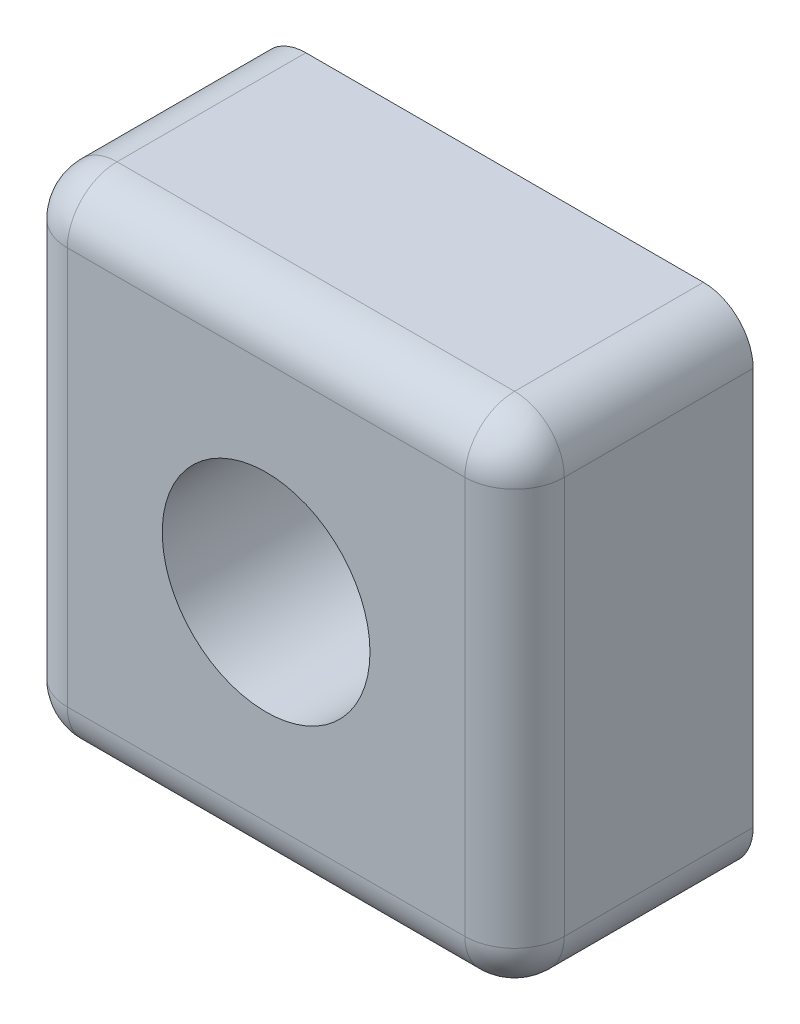
ISO-10303-21;
HEADER;
FILE_DESCRIPTION(('STEP AP214'),'2;1');
FILE_NAME('part.step','',(''),(''),'','','');
FILE_SCHEMA(('AUTOMOTIVE_DESIGN { 1 0 10303 214 1 1 1 1 }'));
ENDSEC;
DATA;
#1=APPLICATION_CONTEXT('core data for automotive mechanical design processes');
#2=APPLICATION_PROTOCOL_DEFINITION('international standard','automotive_design',2000,#1);
#3=PRODUCT_CONTEXT('',#1,'mechanical');
#4=PRODUCT('Part','Part','',(#3));
#5=PRODUCT_RELATED_PRODUCT_CATEGORY('part','',(#4));
#6=PRODUCT_DEFINITION_FORMATION('','',#4);
#7=PRODUCT_DEFINITION_CONTEXT('part definition',#1,'design');
#8=PRODUCT_DEFINITION('design','',#6,#7);
#9=PRODUCT_DEFINITION_SHAPE('','',#8);
#10=(LENGTH_UNIT() NAMED_UNIT(*) SI_UNIT(.MILLI.,.METRE.));
#11=(NAMED_UNIT(*) PLANE_ANGLE_UNIT() SI_UNIT($,.RADIAN.));
#12=(NAMED_UNIT(*) SI_UNIT($,.STERADIAN.) SOLID_ANGLE_UNIT());
#13=UNCERTAINTY_MEASURE_WITH_UNIT(LENGTH_MEASURE(1.E-05),#10,'distance_accuracy_value','');
#14=(GEOMETRIC_REPRESENTATION_CONTEXT(3) GLOBAL_UNCERTAINTY_ASSIGNED_CONTEXT((#13)) GLOBAL_UNIT_ASSIGNED_CONTEXT((#10,
#11,#12)) REPRESENTATION_CONTEXT('',''));
#15=CARTESIAN_POINT('',(0.,0.,0.));
#16=DIRECTION('',(0.,0.,1.));
#17=DIRECTION('',(1.,0.,0.));
#18=AXIS2_PLACEMENT_3D('',#15,#16,#17);
#19=CARTESIAN_POINT('',(0.,-50.,48.));
#20=DIRECTION('',(0.,-1.,0.));
#21=DIRECTION('',(0.,0.,-1.));
#22=AXIS2_PLACEMENT_3D('',#19,#20,#21);
#23=PLANE('',#22);
#24=DIRECTION('',(0.,0.,-1.));
#25=VECTOR('',#24,1.);
#26=CARTESIAN_POINT('',(40.,-50.,48.));
#27=LINE('',#26,#25);
#28=CARTESIAN_POINT('',(40.,-50.,0.));
#29=VERTEX_POINT('',#28);
#30=CARTESIAN_POINT('',(40.,-50.,38.));
#31=VERTEX_POINT('',#30);
#32=EDGE_CURVE('E159',#29,#31,#27,.F.);
#33=ORIENTED_EDGE('',*,*,#32,.T.);
#34=DIRECTION('',(-1.,0.,0.));
#35=VECTOR('',#34,1.);
#36=CARTESIAN_POINT('',(0.,-50.,38.));
#37=LINE('',#36,#35);
#38=CARTESIAN_POINT('',(-40.,-50.,38.));
#39=VERTEX_POINT('',#38);
#40=EDGE_CURVE('E170',#31,#39,#37,.T.);
#41=ORIENTED_EDGE('',*,*,#40,.T.);
#42=DIRECTION('',(0.,0.,-1.));
#43=VECTOR('',#42,1.);
#44=CARTESIAN_POINT('',(-40.,-50.,48.));
#45=LINE('',#44,#43);
#46=CARTESIAN_POINT('',(-40.,-50.,0.));
#47=VERTEX_POINT('',#46);
#48=EDGE_CURVE('E157',#39,#47,#45,.T.);
#49=ORIENTED_EDGE('',*,*,#48,.T.);
#50=DIRECTION('',(-1.,0.,0.));
#51=VECTOR('',#50,1.);
#52=CARTESIAN_POINT('',(0.,-50.,0.));
#53=LINE('',#52,#51);
#54=EDGE_CURVE('E143',#29,#47,#53,.T.);
#55=ORIENTED_EDGE('',*,*,#54,.F.);
#56=EDGE_LOOP('',(#33,#41,#49,#55));
#57=FACE_BOUND('',#56,.T.);
#58=ADVANCED_FACE('F38',(#57),#23,.T.);
#59=CARTESIAN_POINT('',(50.,0.,48.));
#60=DIRECTION('',(-1.,0.,0.));
#61=DIRECTION('',(0.,-1.,0.));
#62=AXIS2_PLACEMENT_3D('',#59,#60,#61);
#63=PLANE('',#62);
#64=DIRECTION('',(0.,0.,-1.));
#65=VECTOR('',#64,1.);
#66=CARTESIAN_POINT('',(50.,40.,48.));
#67=LINE('',#66,#65);
#68=CARTESIAN_POINT('',(50.,40.,0.));
#69=VERTEX_POINT('',#68);
#70=CARTESIAN_POINT('',(50.,40.,38.));
#71=VERTEX_POINT('',#70);
#72=EDGE_CURVE('E127',#69,#71,#67,.F.);
#73=ORIENTED_EDGE('',*,*,#72,.T.);
#74=DIRECTION('',(0.,1.,0.));
#75=VECTOR('',#74,1.);
#76=CARTESIAN_POINT('',(50.,-40.,38.));
#77=LINE('',#76,#75);
#78=CARTESIAN_POINT('',(50.,-40.,38.));
#79=VERTEX_POINT('',#78);
#80=EDGE_CURVE('E11',#71,#79,#77,.F.);
#81=ORIENTED_EDGE('',*,*,#80,.T.);
#82=DIRECTION('',(0.,0.,-1.));
#83=VECTOR('',#82,1.);
#84=CARTESIAN_POINT('',(50.,-40.,0.));
#85=LINE('',#84,#83);
#86=CARTESIAN_POINT('',(50.,-40.,0.));
#87=VERTEX_POINT('',#86);
#88=EDGE_CURVE('E131',#79,#87,#85,.T.);
#89=ORIENTED_EDGE('',*,*,#88,.T.);
#90=DIRECTION('',(0.,1.,0.));
#91=VECTOR('',#90,1.);
#92=CARTESIAN_POINT('',(50.,0.,0.));
#93=LINE('',#92,#91);
#94=EDGE_CURVE('E139',#87,#69,#93,.T.);
#95=ORIENTED_EDGE('',*,*,#94,.T.);
#96=EDGE_LOOP('',(#73,#81,#89,#95));
#97=FACE_BOUND('',#96,.T.);
#98=ADVANCED_FACE('F235',(#97),#63,.F.);
#99=CARTESIAN_POINT('',(0.,50.,48.));
#100=DIRECTION('',(0.,-1.,0.));
#101=DIRECTION('',(0.,0.,-1.));
#102=AXIS2_PLACEMENT_3D('',#99,#100,#101);
#103=PLANE('',#102);
#104=DIRECTION('',(0.,0.,-1.));
#105=VECTOR('',#104,1.);
#106=CARTESIAN_POINT('',(-40.,50.,48.));
#107=LINE('',#106,#105);
#108=CARTESIAN_POINT('',(-40.,50.,0.));
#109=VERTEX_POINT('',#108);
#110=CARTESIAN_POINT('',(-40.,50.,38.));
#111=VERTEX_POINT('',#110);
#112=EDGE_CURVE('E123',#109,#111,#107,.F.);
#113=ORIENTED_EDGE('',*,*,#112,.T.);
#114=DIRECTION('',(-1.,0.,0.));
#115=VECTOR('',#114,1.);
#116=CARTESIAN_POINT('',(40.,50.,38.));
#117=LINE('',#116,#115);
#118=CARTESIAN_POINT('',(40.,50.,38.));
#119=VERTEX_POINT('',#118);
#120=EDGE_CURVE('E62',#111,#119,#117,.F.);
#121=ORIENTED_EDGE('',*,*,#120,.T.);
#122=DIRECTION('',(0.,0.,-1.));
#123=VECTOR('',#122,1.);
#124=CARTESIAN_POINT('',(40.,50.,48.));
#125=LINE('',#124,#123);
#126=CARTESIAN_POINT('',(40.,50.,0.));
#127=VERTEX_POINT('',#126);
#128=EDGE_CURVE('E115',#119,#127,#125,.T.);
#129=ORIENTED_EDGE('',*,*,#128,.T.);
#130=DIRECTION('',(-1.,0.,0.));
#131=VECTOR('',#130,1.);
#132=CARTESIAN_POINT('',(0.,50.,0.));
#133=LINE('',#132,#131);
#134=EDGE_CURVE('E119',#127,#109,#133,.T.);
#135=ORIENTED_EDGE('',*,*,#134,.T.);
#136=EDGE_LOOP('',(#113,#121,#129,#135));
#137=FACE_BOUND('',#136,.T.);
#138=ADVANCED_FACE('F117',(#137),#103,.F.);
#139=CARTESIAN_POINT('',(-50.,0.,48.));
#140=DIRECTION('',(-1.,0.,0.));
#141=DIRECTION('',(0.,-1.,0.));
#142=AXIS2_PLACEMENT_3D('',#139,#140,#141);
#143=PLANE('',#142);
#144=DIRECTION('',(0.,0.,-1.));
#145=VECTOR('',#144,1.);
#146=CARTESIAN_POINT('',(-50.,-40.,48.));
#147=LINE('',#146,#145);
#148=CARTESIAN_POINT('',(-50.,-40.,0.));
#149=VERTEX_POINT('',#148);
#150=CARTESIAN_POINT('',(-50.,-40.,38.));
#151=VERTEX_POINT('',#150);
#152=EDGE_CURVE('E164',#149,#151,#147,.F.);
#153=ORIENTED_EDGE('',*,*,#152,.T.);
#154=DIRECTION('',(0.,1.,0.));
#155=VECTOR('',#154,1.);
#156=CARTESIAN_POINT('',(-50.,0.,38.));
#157=LINE('',#156,#155);
#158=CARTESIAN_POINT('',(-50.,40.,38.));
#159=VERTEX_POINT('',#158);
#160=EDGE_CURVE('E183',#151,#159,#157,.T.);
#161=ORIENTED_EDGE('',*,*,#160,.T.);
#162=DIRECTION('',(0.,0.,-1.));
#163=VECTOR('',#162,1.);
#164=CARTESIAN_POINT('',(-50.,40.,0.));
#165=LINE('',#164,#163);
#166=CARTESIAN_POINT('',(-50.,40.,0.));
#167=VERTEX_POINT('',#166);
#168=EDGE_CURVE('E162',#159,#167,#165,.T.);
#169=ORIENTED_EDGE('',*,*,#168,.T.);
#170=DIRECTION('',(0.,1.,0.));
#171=VECTOR('',#170,1.);
#172=CARTESIAN_POINT('',(-50.,0.,0.));
#173=LINE('',#172,#171);
#174=EDGE_CURVE('E138',#149,#167,#173,.T.);
#175=ORIENTED_EDGE('',*,*,#174,.F.);
#176=EDGE_LOOP('',(#153,#161,#169,#175));
#177=FACE_BOUND('',#176,.T.);
#178=ADVANCED_FACE('F232',(#177),#143,.T.);
#179=CARTESIAN_POINT('',(0.,0.,48.));
#180=DIRECTION('',(0.,0.,-1.));
#181=DIRECTION('',(-1.,0.,0.));
#182=AXIS2_PLACEMENT_3D('',#179,#180,#181);
#183=CYLINDRICAL_SURFACE('',#182,20.9);
#184=CARTESIAN_POINT('',(0.,0.,48.));
#185=DIRECTION('',(0.,0.,1.));
#186=DIRECTION('',(1.,0.,0.));
#187=AXIS2_PLACEMENT_3D('',#184,#185,#186);
#188=CIRCLE('',#187,20.9);
#189=CARTESIAN_POINT('',(20.9,0.,48.));
#190=VERTEX_POINT('',#189);
#191=EDGE_CURVE('E149',#190,#190,#188,.T.);
#192=ORIENTED_EDGE('',*,*,#191,.T.);
#193=EDGE_LOOP('',(#192));
#194=FACE_BOUND('',#193,.T.);
#195=CARTESIAN_POINT('',(0.,0.,0.));
#196=DIRECTION('',(0.,0.,1.));
#197=DIRECTION('',(1.,0.,0.));
#198=AXIS2_PLACEMENT_3D('',#195,#196,#197);
#199=CIRCLE('',#198,20.9);
#200=CARTESIAN_POINT('',(20.9,0.,0.));
#201=VERTEX_POINT('',#200);
#202=EDGE_CURVE('E141',#201,#201,#199,.T.);
#203=ORIENTED_EDGE('',*,*,#202,.F.);
#204=EDGE_LOOP('',(#203));
#205=FACE_BOUND('',#204,.T.);
#206=ADVANCED_FACE('F220',(#194,#205),#183,.F.);
#207=CARTESIAN_POINT('',(0.,0.,48.));
#208=DIRECTION('',(0.,0.,1.));
#209=DIRECTION('',(1.,0.,0.));
#210=AXIS2_PLACEMENT_3D('',#207,#208,#209);
#211=PLANE('',#210);
#212=DIRECTION('',(0.,1.,0.));
#213=VECTOR('',#212,1.);
#214=CARTESIAN_POINT('',(-40.,0.,48.));
#215=LINE('',#214,#213);
#216=CARTESIAN_POINT('',(-40.,40.,48.));
#217=VERTEX_POINT('',#216);
#218=CARTESIAN_POINT('',(-40.,-40.,48.));
#219=VERTEX_POINT('',#218);
#220=EDGE_CURVE('E176',#217,#219,#215,.F.);
#221=ORIENTED_EDGE('',*,*,#220,.T.);
#222=DIRECTION('',(-1.,0.,0.));
#223=VECTOR('',#222,1.);
#224=CARTESIAN_POINT('',(0.,-40.,48.));
#225=LINE('',#224,#223);
#226=CARTESIAN_POINT('',(40.,-40.,48.));
#227=VERTEX_POINT('',#226);
#228=EDGE_CURVE('E178',#219,#227,#225,.F.);
#229=ORIENTED_EDGE('',*,*,#228,.T.);
#230=DIRECTION('',(0.,1.,0.));
#231=VECTOR('',#230,1.);
#232=CARTESIAN_POINT('',(40.,40.,48.));
#233=LINE('',#232,#231);
#234=CARTESIAN_POINT('',(40.,40.,48.));
#235=VERTEX_POINT('',#234);
#236=EDGE_CURVE('E172',#227,#235,#233,.T.);
#237=ORIENTED_EDGE('',*,*,#236,.T.);
#238=DIRECTION('',(-1.,0.,0.));
#239=VECTOR('',#238,1.);
#240=CARTESIAN_POINT('',(-40.,40.,48.));
#241=LINE('',#240,#239);
#242=EDGE_CURVE('E174',#235,#217,#241,.T.);
#243=ORIENTED_EDGE('',*,*,#242,.T.);
#244=EDGE_LOOP('',(#221,#229,#237,#243));
#245=FACE_BOUND('',#244,.T.);
#246=ORIENTED_EDGE('',*,*,#191,.F.);
#247=EDGE_LOOP('',(#246));
#248=FACE_BOUND('',#247,.T.);
#249=ADVANCED_FACE('F223',(#245,#248),#211,.T.);
#250=CARTESIAN_POINT('',(0.,0.,0.));
#251=DIRECTION('',(0.,0.,1.));
#252=DIRECTION('',(1.,0.,0.));
#253=AXIS2_PLACEMENT_3D('',#250,#251,#252);
#254=PLANE('',#253);
#255=ORIENTED_EDGE('',*,*,#134,.F.);
#256=CARTESIAN_POINT('',(40.,40.,0.));
#257=DIRECTION('',(0.,0.,1.));
#258=DIRECTION('',(1.,0.,0.));
#259=AXIS2_PLACEMENT_3D('',#256,#257,#258);
#260=CIRCLE('',#259,10.);
#261=EDGE_CURVE('E125',#127,#69,#260,.F.);
#262=ORIENTED_EDGE('',*,*,#261,.T.);
#263=ORIENTED_EDGE('',*,*,#94,.F.);
#264=CARTESIAN_POINT('',(40.,-40.,0.));
#265=DIRECTION('',(0.,0.,1.));
#266=DIRECTION('',(1.,0.,0.));
#267=AXIS2_PLACEMENT_3D('',#264,#265,#266);
#268=CIRCLE('',#267,10.);
#269=EDGE_CURVE('E132',#87,#29,#268,.F.);
#270=ORIENTED_EDGE('',*,*,#269,.T.);
#271=ORIENTED_EDGE('',*,*,#54,.T.);
#272=CARTESIAN_POINT('',(-40.,-40.,0.));
#273=DIRECTION('',(0.,0.,1.));
#274=DIRECTION('',(1.,0.,0.));
#275=AXIS2_PLACEMENT_3D('',#272,#273,#274);
#276=CIRCLE('',#275,10.);
#277=EDGE_CURVE('E152',#47,#149,#276,.F.);
#278=ORIENTED_EDGE('',*,*,#277,.T.);
#279=ORIENTED_EDGE('',*,*,#174,.T.);
#280=CARTESIAN_POINT('',(-40.,40.,0.));
#281=DIRECTION('',(0.,0.,1.));
#282=DIRECTION('',(1.,0.,0.));
#283=AXIS2_PLACEMENT_3D('',#280,#281,#282);
#284=CIRCLE('',#283,10.);
#285=EDGE_CURVE('E122',#167,#109,#284,.F.);
#286=ORIENTED_EDGE('',*,*,#285,.T.);
#287=EDGE_LOOP('',(#255,#262,#263,#270,#271,#278,#279,#286));
#288=FACE_BOUND('',#287,.T.);
#289=ORIENTED_EDGE('',*,*,#202,.T.);
#290=EDGE_LOOP('',(#289));
#291=FACE_BOUND('',#290,.T.);
#292=ADVANCED_FACE('F134',(#288,#291),#254,.F.);
#293=CARTESIAN_POINT('',(40.,40.,48.));
#294=DIRECTION('',(0.,0.,-1.));
#295=DIRECTION('',(-1.,0.,0.));
#296=AXIS2_PLACEMENT_3D('',#293,#294,#295);
#297=CYLINDRICAL_SURFACE('',#296,10.);
#298=ORIENTED_EDGE('',*,*,#128,.F.);
#299=CARTESIAN_POINT('',(40.,40.,38.));
#300=DIRECTION('',(0.,0.,-1.));
#301=DIRECTION('',(-1.,0.,0.));
#302=AXIS2_PLACEMENT_3D('',#299,#300,#301);
#303=CIRCLE('',#302,10.);
#304=EDGE_CURVE('E47',#119,#71,#303,.T.);
#305=ORIENTED_EDGE('',*,*,#304,.T.);
#306=ORIENTED_EDGE('',*,*,#72,.F.);
#307=ORIENTED_EDGE('',*,*,#261,.F.);
#308=EDGE_LOOP('',(#298,#305,#306,#307));
#309=FACE_BOUND('',#308,.T.);
#310=ADVANCED_FACE('F126',(#309),#297,.T.);
#311=CARTESIAN_POINT('',(40.,-40.,48.));
#312=DIRECTION('',(0.,0.,1.));
#313=DIRECTION('',(1.,0.,0.));
#314=AXIS2_PLACEMENT_3D('',#311,#312,#313);
#315=CYLINDRICAL_SURFACE('',#314,10.);
#316=ORIENTED_EDGE('',*,*,#88,.F.);
#317=CARTESIAN_POINT('',(40.,-40.,38.));
#318=DIRECTION('',(0.,0.,1.));
#319=DIRECTION('',(1.,0.,0.));
#320=AXIS2_PLACEMENT_3D('',#317,#318,#319);
#321=CIRCLE('',#320,10.);
#322=EDGE_CURVE('E167',#79,#31,#321,.F.);
#323=ORIENTED_EDGE('',*,*,#322,.T.);
#324=ORIENTED_EDGE('',*,*,#32,.F.);
#325=ORIENTED_EDGE('',*,*,#269,.F.);
#326=EDGE_LOOP('',(#316,#323,#324,#325));
#327=FACE_BOUND('',#326,.T.);
#328=ADVANCED_FACE('F247',(#327),#315,.T.);
#329=CARTESIAN_POINT('',(-40.,-40.,48.));
#330=DIRECTION('',(0.,0.,-1.));
#331=DIRECTION('',(-1.,0.,0.));
#332=AXIS2_PLACEMENT_3D('',#329,#330,#331);
#333=CYLINDRICAL_SURFACE('',#332,10.);
#334=ORIENTED_EDGE('',*,*,#48,.F.);
#335=CARTESIAN_POINT('',(-40.,-40.,38.));
#336=DIRECTION('',(0.,0.,-1.));
#337=DIRECTION('',(-1.,0.,0.));
#338=AXIS2_PLACEMENT_3D('',#335,#336,#337);
#339=CIRCLE('',#338,10.);
#340=EDGE_CURVE('E181',#39,#151,#339,.T.);
#341=ORIENTED_EDGE('',*,*,#340,.T.);
#342=ORIENTED_EDGE('',*,*,#152,.F.);
#343=ORIENTED_EDGE('',*,*,#277,.F.);
#344=EDGE_LOOP('',(#334,#341,#342,#343));
#345=FACE_BOUND('',#344,.T.);
#346=ADVANCED_FACE('F250',(#345),#333,.T.);
#347=CARTESIAN_POINT('',(-40.,40.,48.));
#348=DIRECTION('',(0.,0.,1.));
#349=DIRECTION('',(1.,0.,0.));
#350=AXIS2_PLACEMENT_3D('',#347,#348,#349);
#351=CYLINDRICAL_SURFACE('',#350,10.);
#352=ORIENTED_EDGE('',*,*,#168,.F.);
#353=CARTESIAN_POINT('',(-40.,40.,38.));
#354=DIRECTION('',(0.,0.,1.));
#355=DIRECTION('',(1.,0.,0.));
#356=AXIS2_PLACEMENT_3D('',#353,#354,#355);
#357=CIRCLE('',#356,10.);
#358=EDGE_CURVE('E185',#159,#111,#357,.F.);
#359=ORIENTED_EDGE('',*,*,#358,.T.);
#360=ORIENTED_EDGE('',*,*,#112,.F.);
#361=ORIENTED_EDGE('',*,*,#285,.F.);
#362=EDGE_LOOP('',(#352,#359,#360,#361));
#363=FACE_BOUND('',#362,.T.);
#364=ADVANCED_FACE('F254',(#363),#351,.T.);
#365=CARTESIAN_POINT('',(-40.,40.,38.));
#366=DIRECTION('',(0.,0.,1.));
#367=DIRECTION('',(1.,0.,0.));
#368=AXIS2_PLACEMENT_3D('',#365,#366,#367);
#369=SPHERICAL_SURFACE('',#368,10.);
#370=CARTESIAN_POINT('',(-40.,40.,38.));
#371=DIRECTION('',(1.,0.,0.));
#372=DIRECTION('',(0.,0.,-1.));
#373=AXIS2_PLACEMENT_3D('',#370,#371,#372);
#374=CIRCLE('',#373,10.);
#375=EDGE_CURVE('E204',#111,#217,#374,.T.);
#376=ORIENTED_EDGE('',*,*,#375,.F.);
#377=ORIENTED_EDGE('',*,*,#358,.F.);
#378=CARTESIAN_POINT('',(-40.,40.,38.));
#379=DIRECTION('',(0.,-1.,0.));
#380=DIRECTION('',(0.,0.,-1.));
#381=AXIS2_PLACEMENT_3D('',#378,#379,#380);
#382=CIRCLE('',#381,10.);
#383=EDGE_CURVE('E42',#217,#159,#382,.T.);
#384=ORIENTED_EDGE('',*,*,#383,.F.);
#385=EDGE_LOOP('',(#376,#377,#384));
#386=FACE_BOUND('',#385,.T.);
#387=ADVANCED_FACE('F40',(#386),#369,.T.);
#388=CARTESIAN_POINT('',(-40.,0.,38.));
#389=DIRECTION('',(0.,1.,0.));
#390=DIRECTION('',(-1.,0.,0.));
#391=AXIS2_PLACEMENT_3D('',#388,#389,#390);
#392=CYLINDRICAL_SURFACE('',#391,10.);
#393=ORIENTED_EDGE('',*,*,#383,.T.);
#394=ORIENTED_EDGE('',*,*,#160,.F.);
#395=CARTESIAN_POINT('',(-40.,-40.,38.));
#396=DIRECTION('',(0.,-1.,0.));
#397=DIRECTION('',(0.,0.,-1.));
#398=AXIS2_PLACEMENT_3D('',#395,#396,#397);
#399=CIRCLE('',#398,10.);
#400=EDGE_CURVE('E202',#219,#151,#399,.T.);
#401=ORIENTED_EDGE('',*,*,#400,.F.);
#402=ORIENTED_EDGE('',*,*,#220,.F.);
#403=EDGE_LOOP('',(#393,#394,#401,#402));
#404=FACE_BOUND('',#403,.T.);
#405=ADVANCED_FACE('F281',(#404),#392,.T.);
#406=CARTESIAN_POINT('',(0.,40.,38.));
#407=DIRECTION('',(1.,0.,0.));
#408=DIRECTION('',(0.,0.,-1.));
#409=AXIS2_PLACEMENT_3D('',#406,#407,#408);
#410=CYLINDRICAL_SURFACE('',#409,10.);
#411=ORIENTED_EDGE('',*,*,#375,.T.);
#412=ORIENTED_EDGE('',*,*,#242,.F.);
#413=CARTESIAN_POINT('',(40.,40.,38.));
#414=DIRECTION('',(1.,0.,0.));
#415=DIRECTION('',(0.,0.,-1.));
#416=AXIS2_PLACEMENT_3D('',#413,#414,#415);
#417=CIRCLE('',#416,10.);
#418=EDGE_CURVE('E199',#119,#235,#417,.T.);
#419=ORIENTED_EDGE('',*,*,#418,.F.);
#420=ORIENTED_EDGE('',*,*,#120,.F.);
#421=EDGE_LOOP('',(#411,#412,#419,#420));
#422=FACE_BOUND('',#421,.T.);
#423=ADVANCED_FACE('F278',(#422),#410,.T.);
#424=CARTESIAN_POINT('',(-40.,-40.,38.));
#425=DIRECTION('',(0.,0.,1.));
#426=DIRECTION('',(1.,0.,0.));
#427=AXIS2_PLACEMENT_3D('',#424,#425,#426);
#428=SPHERICAL_SURFACE('',#427,10.);
#429=ORIENTED_EDGE('',*,*,#400,.T.);
#430=ORIENTED_EDGE('',*,*,#340,.F.);
#431=CARTESIAN_POINT('',(-40.,-40.,38.));
#432=DIRECTION('',(1.,0.,0.));
#433=DIRECTION('',(0.,0.,-1.));
#434=AXIS2_PLACEMENT_3D('',#431,#432,#433);
#435=CIRCLE('',#434,10.);
#436=EDGE_CURVE('E196',#219,#39,#435,.T.);
#437=ORIENTED_EDGE('',*,*,#436,.F.);
#438=EDGE_LOOP('',(#429,#430,#437));
#439=FACE_BOUND('',#438,.T.);
#440=ADVANCED_FACE('F274',(#439),#428,.T.);
#441=CARTESIAN_POINT('',(40.,40.,38.));
#442=DIRECTION('',(0.,0.,1.));
#443=DIRECTION('',(1.,0.,0.));
#444=AXIS2_PLACEMENT_3D('',#441,#442,#443);
#445=SPHERICAL_SURFACE('',#444,10.);
#446=ORIENTED_EDGE('',*,*,#304,.F.);
#447=ORIENTED_EDGE('',*,*,#418,.T.);
#448=CARTESIAN_POINT('',(40.,40.,38.));
#449=DIRECTION('',(0.,-1.,0.));
#450=DIRECTION('',(0.,0.,-1.));
#451=AXIS2_PLACEMENT_3D('',#448,#449,#450);
#452=CIRCLE('',#451,10.);
#453=EDGE_CURVE('E193',#71,#235,#452,.T.);
#454=ORIENTED_EDGE('',*,*,#453,.F.);
#455=EDGE_LOOP('',(#446,#447,#454));
#456=FACE_BOUND('',#455,.T.);
#457=ADVANCED_FACE('F270',(#456),#445,.T.);
#458=CARTESIAN_POINT('',(0.,-40.,38.));
#459=DIRECTION('',(-1.,0.,0.));
#460=DIRECTION('',(0.,0.,1.));
#461=AXIS2_PLACEMENT_3D('',#458,#459,#460);
#462=CYLINDRICAL_SURFACE('',#461,10.);
#463=ORIENTED_EDGE('',*,*,#436,.T.);
#464=ORIENTED_EDGE('',*,*,#40,.F.);
#465=CARTESIAN_POINT('',(40.,-40.,38.));
#466=DIRECTION('',(1.,0.,0.));
#467=DIRECTION('',(0.,0.,-1.));
#468=AXIS2_PLACEMENT_3D('',#465,#466,#467);
#469=CIRCLE('',#468,10.);
#470=EDGE_CURVE('E191',#227,#31,#469,.T.);
#471=ORIENTED_EDGE('',*,*,#470,.F.);
#472=ORIENTED_EDGE('',*,*,#228,.F.);
#473=EDGE_LOOP('',(#463,#464,#471,#472));
#474=FACE_BOUND('',#473,.T.);
#475=ADVANCED_FACE('F266',(#474),#462,.T.);
#476=CARTESIAN_POINT('',(40.,0.,38.));
#477=DIRECTION('',(0.,-1.,0.));
#478=DIRECTION('',(1.,0.,0.));
#479=AXIS2_PLACEMENT_3D('',#476,#477,#478);
#480=CYLINDRICAL_SURFACE('',#479,10.);
#481=ORIENTED_EDGE('',*,*,#453,.T.);
#482=ORIENTED_EDGE('',*,*,#236,.F.);
#483=CARTESIAN_POINT('',(40.,-40.,38.));
#484=DIRECTION('',(0.,-1.,0.));
#485=DIRECTION('',(0.,0.,-1.));
#486=AXIS2_PLACEMENT_3D('',#483,#484,#485);
#487=CIRCLE('',#486,10.);
#488=EDGE_CURVE('E189',#79,#227,#487,.T.);
#489=ORIENTED_EDGE('',*,*,#488,.F.);
#490=ORIENTED_EDGE('',*,*,#80,.F.);
#491=EDGE_LOOP('',(#481,#482,#489,#490));
#492=FACE_BOUND('',#491,.T.);
#493=ADVANCED_FACE('F262',(#492),#480,.T.);
#494=CARTESIAN_POINT('',(40.,-40.,38.));
#495=DIRECTION('',(0.,0.,1.));
#496=DIRECTION('',(1.,0.,0.));
#497=AXIS2_PLACEMENT_3D('',#494,#495,#496);
#498=SPHERICAL_SURFACE('',#497,10.);
#499=ORIENTED_EDGE('',*,*,#470,.T.);
#500=ORIENTED_EDGE('',*,*,#322,.F.);
#501=ORIENTED_EDGE('',*,*,#488,.T.);
#502=EDGE_LOOP('',(#499,#500,#501));
#503=FACE_BOUND('',#502,.T.);
#504=ADVANCED_FACE('F259',(#503),#498,.T.);
#505=CLOSED_SHELL('',(#58,#98,#138,#178,#206,#249,#292,#310,#328,#346,#364,#387,#405,#423,#440,
#457,#475,#493,#504));
#506=MANIFOLD_SOLID_BREP('B2',#505);
#507=ADVANCED_BREP_SHAPE_REPRESENTATION('',(#18,#506),#14);
#508=SHAPE_DEFINITION_REPRESENTATION(#9,#507);
ENDSEC;
END-ISO-10303-21;
